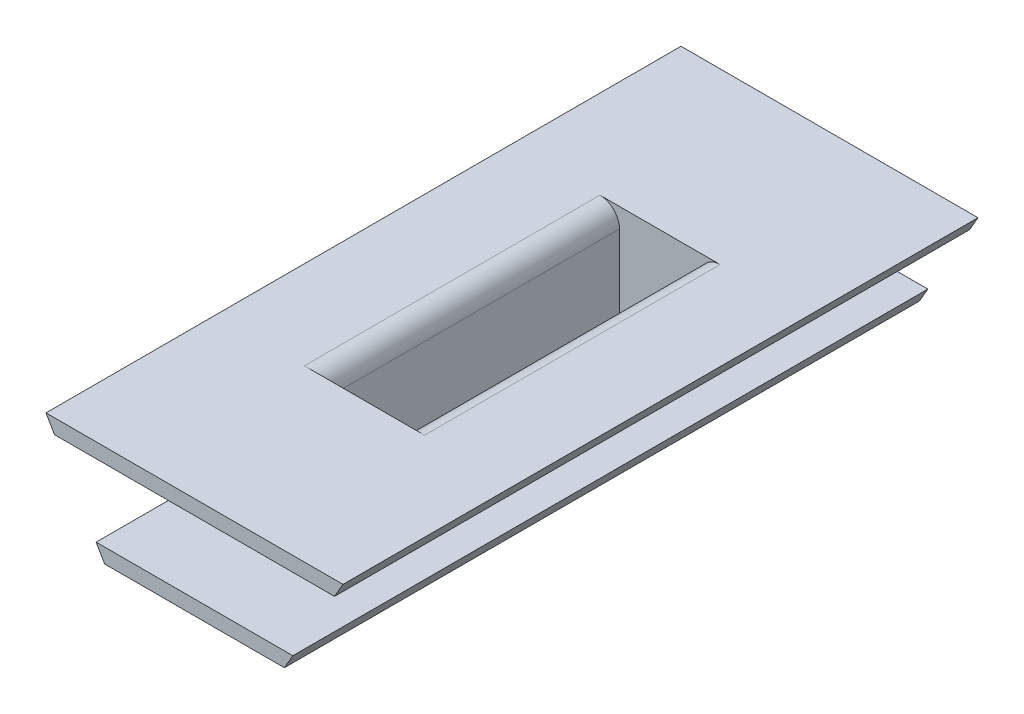
ISO-10303-21;
HEADER;
FILE_DESCRIPTION(('STEP AP214'),'2;1');
FILE_NAME('part.step','',(''),(''),'','','');
FILE_SCHEMA(('AUTOMOTIVE_DESIGN { 1 0 10303 214 1 1 1 1 }'));
ENDSEC;
DATA;
#1=APPLICATION_CONTEXT('core data for automotive mechanical design processes');
#2=APPLICATION_PROTOCOL_DEFINITION('international standard','automotive_design',2000,#1);
#3=PRODUCT_CONTEXT('',#1,'mechanical');
#4=PRODUCT('Part','Part','',(#3));
#5=PRODUCT_RELATED_PRODUCT_CATEGORY('part','',(#4));
#6=PRODUCT_DEFINITION_FORMATION('','',#4);
#7=PRODUCT_DEFINITION_CONTEXT('part definition',#1,'design');
#8=PRODUCT_DEFINITION('design','',#6,#7);
#9=PRODUCT_DEFINITION_SHAPE('','',#8);
#10=(LENGTH_UNIT() NAMED_UNIT(*) SI_UNIT(.MILLI.,.METRE.));
#11=(NAMED_UNIT(*) PLANE_ANGLE_UNIT() SI_UNIT($,.RADIAN.));
#12=(NAMED_UNIT(*) SI_UNIT($,.STERADIAN.) SOLID_ANGLE_UNIT());
#13=UNCERTAINTY_MEASURE_WITH_UNIT(LENGTH_MEASURE(1.E-05),#10,'distance_accuracy_value','');
#14=(GEOMETRIC_REPRESENTATION_CONTEXT(3) GLOBAL_UNCERTAINTY_ASSIGNED_CONTEXT((#13)) GLOBAL_UNIT_ASSIGNED_CONTEXT((#10,
#11,#12)) REPRESENTATION_CONTEXT('',''));
#15=CARTESIAN_POINT('',(0.,0.,0.));
#16=DIRECTION('',(0.,0.,1.));
#17=DIRECTION('',(1.,0.,0.));
#18=AXIS2_PLACEMENT_3D('',#15,#16,#17);
#19=CARTESIAN_POINT('',(0.,0.,0.));
#20=DIRECTION('',(0.,0.,1.));
#21=DIRECTION('',(1.,0.,0.));
#22=AXIS2_PLACEMENT_3D('',#19,#20,#21);
#23=PLANE('',#22);
#24=DIRECTION('',(1.,0.,0.));
#25=VECTOR('',#24,1.);
#26=CARTESIAN_POINT('',(0.,8.89230484541331,0.));
#27=LINE('',#26,#25);
#28=CARTESIAN_POINT('',(5.15,8.89230484541331,0.));
#29=VERTEX_POINT('',#28);
#30=CARTESIAN_POINT('',(14.3339745962156,8.89230484541331,0.));
#31=VERTEX_POINT('',#30);
#32=EDGE_CURVE('E344',#29,#31,#27,.T.);
#33=ORIENTED_EDGE('',*,*,#32,.F.);
#34=DIRECTION('',(0.,-1.,0.));
#35=VECTOR('',#34,1.);
#36=CARTESIAN_POINT('',(5.15,1.5,0.));
#37=LINE('',#36,#35);
#38=CARTESIAN_POINT('',(5.15,8.90522356007797,0.));
#39=VERTEX_POINT('',#38);
#40=EDGE_CURVE('E275',#39,#29,#37,.T.);
#41=ORIENTED_EDGE('',*,*,#40,.F.);
#42=DIRECTION('',(1.,0.,0.));
#43=VECTOR('',#42,1.);
#44=CARTESIAN_POINT('',(5.15,8.90522356007797,0.));
#45=LINE('',#44,#43);
#46=CARTESIAN_POINT('',(-5.15,8.90522356007797,0.));
#47=VERTEX_POINT('',#46);
#48=EDGE_CURVE('E287',#47,#39,#45,.T.);
#49=ORIENTED_EDGE('',*,*,#48,.F.);
#50=DIRECTION('',(0.,-1.,0.));
#51=VECTOR('',#50,1.);
#52=CARTESIAN_POINT('',(-5.15,0.,0.));
#53=LINE('',#52,#51);
#54=CARTESIAN_POINT('',(-5.15,8.89230484541331,0.));
#55=VERTEX_POINT('',#54);
#56=EDGE_CURVE('E464',#47,#55,#53,.T.);
#57=ORIENTED_EDGE('',*,*,#56,.T.);
#58=DIRECTION('',(1.,0.,0.));
#59=VECTOR('',#58,1.);
#60=CARTESIAN_POINT('',(0.,8.89230484541331,0.));
#61=LINE('',#60,#59);
#62=CARTESIAN_POINT('',(-14.3339745962156,8.89230484541331,0.));
#63=VERTEX_POINT('',#62);
#64=EDGE_CURVE('E399',#63,#55,#61,.T.);
#65=ORIENTED_EDGE('',*,*,#64,.F.);
#66=DIRECTION('',(-0.499999999999998,0.86602540378444,0.));
#67=VECTOR('',#66,1.);
#68=CARTESIAN_POINT('',(-6.90000000000002,-3.98371685740841,0.));
#69=LINE('',#68,#67);
#70=CARTESIAN_POINT('',(-15.2,10.3923048454133,0.));
#71=VERTEX_POINT('',#70);
#72=EDGE_CURVE('E395',#63,#71,#69,.T.);
#73=ORIENTED_EDGE('',*,*,#72,.T.);
#74=DIRECTION('',(1.,0.,0.));
#75=VECTOR('',#74,1.);
#76=CARTESIAN_POINT('',(0.,10.3923048454133,0.));
#77=LINE('',#76,#75);
#78=CARTESIAN_POINT('',(15.2,10.3923048454133,0.));
#79=VERTEX_POINT('',#78);
#80=EDGE_CURVE('E391',#71,#79,#77,.T.);
#81=ORIENTED_EDGE('',*,*,#80,.T.);
#82=DIRECTION('',(0.499999999999998,0.86602540378444,0.));
#83=VECTOR('',#82,1.);
#84=CARTESIAN_POINT('',(6.90000000000002,-3.98371685740841,0.));
#85=LINE('',#84,#83);
#86=EDGE_CURVE('E387',#31,#79,#85,.T.);
#87=ORIENTED_EDGE('',*,*,#86,.F.);
#88=EDGE_LOOP('',(#33,#41,#49,#57,#65,#73,#81,#87));
#89=FACE_BOUND('',#88,.T.);
#90=ADVANCED_FACE('F38',(#89),#23,.F.);
#91=CARTESIAN_POINT('',(0.,0.,65.));
#92=DIRECTION('',(0.,0.,1.));
#93=DIRECTION('',(1.,0.,0.));
#94=AXIS2_PLACEMENT_3D('',#91,#92,#93);
#95=PLANE('',#94);
#96=DIRECTION('',(0.,-1.,0.));
#97=VECTOR('',#96,1.);
#98=CARTESIAN_POINT('',(-5.15,1.5,65.));
#99=LINE('',#98,#97);
#100=CARTESIAN_POINT('',(-5.15,8.89239568237227,65.));
#101=VERTEX_POINT('',#100);
#102=CARTESIAN_POINT('',(-5.15,8.89230484541331,65.));
#103=VERTEX_POINT('',#102);
#104=EDGE_CURVE('E318',#101,#103,#99,.T.);
#105=ORIENTED_EDGE('',*,*,#104,.F.);
#106=DIRECTION('',(-1.,0.,0.));
#107=VECTOR('',#106,1.);
#108=CARTESIAN_POINT('',(-5.15,8.89239568237227,65.));
#109=LINE('',#108,#107);
#110=CARTESIAN_POINT('',(5.15,8.89239568237227,65.));
#111=VERTEX_POINT('',#110);
#112=EDGE_CURVE('E324',#111,#101,#109,.T.);
#113=ORIENTED_EDGE('',*,*,#112,.F.);
#114=DIRECTION('',(0.,1.,0.));
#115=VECTOR('',#114,1.);
#116=CARTESIAN_POINT('',(5.15,0.,65.));
#117=LINE('',#116,#115);
#118=CARTESIAN_POINT('',(5.15,8.89230484541331,65.));
#119=VERTEX_POINT('',#118);
#120=EDGE_CURVE('E461',#119,#111,#117,.T.);
#121=ORIENTED_EDGE('',*,*,#120,.F.);
#122=DIRECTION('',(1.,0.,0.));
#123=VECTOR('',#122,1.);
#124=CARTESIAN_POINT('',(0.,8.89230484541331,65.));
#125=LINE('',#124,#123);
#126=CARTESIAN_POINT('',(14.3339745962156,8.89230484541331,65.));
#127=VERTEX_POINT('',#126);
#128=EDGE_CURVE('E348',#119,#127,#125,.T.);
#129=ORIENTED_EDGE('',*,*,#128,.T.);
#130=DIRECTION('',(0.499999999999998,0.86602540378444,0.));
#131=VECTOR('',#130,1.);
#132=CARTESIAN_POINT('',(6.90000000000002,-3.98371685740841,65.));
#133=LINE('',#132,#131);
#134=CARTESIAN_POINT('',(15.2,10.3923048454133,65.));
#135=VERTEX_POINT('',#134);
#136=EDGE_CURVE('E352',#127,#135,#133,.T.);
#137=ORIENTED_EDGE('',*,*,#136,.T.);
#138=DIRECTION('',(1.,0.,0.));
#139=VECTOR('',#138,1.);
#140=CARTESIAN_POINT('',(0.,10.3923048454133,65.));
#141=LINE('',#140,#139);
#142=CARTESIAN_POINT('',(-15.2,10.3923048454133,65.));
#143=VERTEX_POINT('',#142);
#144=EDGE_CURVE('E356',#143,#135,#141,.T.);
#145=ORIENTED_EDGE('',*,*,#144,.F.);
#146=DIRECTION('',(-0.499999999999998,0.86602540378444,0.));
#147=VECTOR('',#146,1.);
#148=CARTESIAN_POINT('',(-6.90000000000002,-3.98371685740841,65.));
#149=LINE('',#148,#147);
#150=CARTESIAN_POINT('',(-14.3339745962156,8.89230484541331,65.));
#151=VERTEX_POINT('',#150);
#152=EDGE_CURVE('E360',#151,#143,#149,.T.);
#153=ORIENTED_EDGE('',*,*,#152,.F.);
#154=DIRECTION('',(1.,0.,0.));
#155=VECTOR('',#154,1.);
#156=CARTESIAN_POINT('',(0.,8.89230484541331,65.));
#157=LINE('',#156,#155);
#158=EDGE_CURVE('E364',#151,#103,#157,.T.);
#159=ORIENTED_EDGE('',*,*,#158,.T.);
#160=EDGE_LOOP('',(#105,#113,#121,#129,#137,#145,#153,#159));
#161=FACE_BOUND('',#160,.T.);
#162=ADVANCED_FACE('F577',(#161),#95,.T.);
#163=CARTESIAN_POINT('',(0.,8.89230484541331,65.));
#164=DIRECTION('',(0.,1.,0.));
#165=DIRECTION('',(0.,0.,1.));
#166=AXIS2_PLACEMENT_3D('',#163,#164,#165);
#167=PLANE('',#166);
#168=ORIENTED_EDGE('',*,*,#32,.T.);
#169=DIRECTION('',(0.,0.,-1.));
#170=VECTOR('',#169,1.);
#171=CARTESIAN_POINT('',(14.3339745962156,8.89230484541331,65.));
#172=LINE('',#171,#170);
#173=EDGE_CURVE('E457',#127,#31,#172,.T.);
#174=ORIENTED_EDGE('',*,*,#173,.F.);
#175=ORIENTED_EDGE('',*,*,#128,.F.);
#176=DIRECTION('',(0.,0.,-1.));
#177=VECTOR('',#176,1.);
#178=CARTESIAN_POINT('',(5.15,8.89230484541331,65.));
#179=LINE('',#178,#177);
#180=CARTESIAN_POINT('',(5.15,8.89230484541331,48.65));
#181=VERTEX_POINT('',#180);
#182=EDGE_CURVE('E418',#119,#181,#179,.T.);
#183=ORIENTED_EDGE('',*,*,#182,.T.);
#184=DIRECTION('',(1.,0.,0.));
#185=VECTOR('',#184,1.);
#186=CARTESIAN_POINT('',(0.,8.89230484541331,48.65));
#187=LINE('',#186,#185);
#188=CARTESIAN_POINT('',(4.15,8.89230484541331,48.65));
#189=VERTEX_POINT('',#188);
#190=EDGE_CURVE('E468',#189,#181,#187,.T.);
#191=ORIENTED_EDGE('',*,*,#190,.F.);
#192=CARTESIAN_POINT('',(4.15,8.89230484541331,47.65));
#193=DIRECTION('',(0.,1.,0.));
#194=DIRECTION('',(0.,0.,1.));
#195=AXIS2_PLACEMENT_3D('',#192,#193,#194);
#196=CIRCLE('',#195,1.);
#197=CARTESIAN_POINT('',(5.15,8.89230484541331,47.65));
#198=VERTEX_POINT('',#197);
#199=EDGE_CURVE('E516',#189,#198,#196,.T.);
#200=ORIENTED_EDGE('',*,*,#199,.T.);
#201=CARTESIAN_POINT('',(5.15,8.89230484541331,17.35));
#202=VERTEX_POINT('',#201);
#203=EDGE_CURVE('E383',#198,#202,#179,.T.);
#204=ORIENTED_EDGE('',*,*,#203,.T.);
#205=CARTESIAN_POINT('',(4.15,8.89230484541331,17.35));
#206=DIRECTION('',(0.,1.,0.));
#207=DIRECTION('',(0.,0.,1.));
#208=AXIS2_PLACEMENT_3D('',#205,#206,#207);
#209=CIRCLE('',#208,1.);
#210=CARTESIAN_POINT('',(4.15,8.89230484541331,16.35));
#211=VERTEX_POINT('',#210);
#212=EDGE_CURVE('E531',#202,#211,#209,.T.);
#213=ORIENTED_EDGE('',*,*,#212,.T.);
#214=DIRECTION('',(-1.,0.,0.));
#215=VECTOR('',#214,1.);
#216=CARTESIAN_POINT('',(0.,8.89230484541331,16.35));
#217=LINE('',#216,#215);
#218=CARTESIAN_POINT('',(5.15,8.89230484541331,16.35));
#219=VERTEX_POINT('',#218);
#220=EDGE_CURVE('E495',#219,#211,#217,.T.);
#221=ORIENTED_EDGE('',*,*,#220,.F.);
#222=DIRECTION('',(0.,0.,-1.));
#223=VECTOR('',#222,1.);
#224=CARTESIAN_POINT('',(5.15,8.89230484541331,65.));
#225=LINE('',#224,#223);
#226=EDGE_CURVE('E314',#219,#29,#225,.T.);
#227=ORIENTED_EDGE('',*,*,#226,.T.);
#228=EDGE_LOOP('',(#168,#174,#175,#183,#191,#200,#204,#213,#221,#227));
#229=FACE_BOUND('',#228,.T.);
#230=ADVANCED_FACE('F584',(#229),#167,.F.);
#231=CARTESIAN_POINT('',(6.90000000000002,-3.98371685740841,65.));
#232=DIRECTION('',(-0.86602540378444,0.499999999999998,0.));
#233=DIRECTION('',(-0.499999999999998,-0.86602540378444,0.));
#234=AXIS2_PLACEMENT_3D('',#231,#232,#233);
#235=PLANE('',#234);
#236=ORIENTED_EDGE('',*,*,#86,.T.);
#237=DIRECTION('',(0.,0.,-1.));
#238=VECTOR('',#237,1.);
#239=CARTESIAN_POINT('',(15.2,10.3923048454133,65.));
#240=LINE('',#239,#238);
#241=EDGE_CURVE('E454',#135,#79,#240,.T.);
#242=ORIENTED_EDGE('',*,*,#241,.F.);
#243=ORIENTED_EDGE('',*,*,#136,.F.);
#244=ORIENTED_EDGE('',*,*,#173,.T.);
#245=EDGE_LOOP('',(#236,#242,#243,#244));
#246=FACE_BOUND('',#245,.T.);
#247=ADVANCED_FACE('F641',(#246),#235,.F.);
#248=CARTESIAN_POINT('',(0.,10.3923048454133,65.));
#249=DIRECTION('',(0.,1.,0.));
#250=DIRECTION('',(0.,0.,1.));
#251=AXIS2_PLACEMENT_3D('',#248,#249,#250);
#252=PLANE('',#251);
#253=DIRECTION('',(0.,0.,1.));
#254=VECTOR('',#253,1.);
#255=CARTESIAN_POINT('',(6.15,10.3923048454133,65.));
#256=LINE('',#255,#254);
#257=CARTESIAN_POINT('',(6.15,10.3923048454133,17.35));
#258=VERTEX_POINT('',#257);
#259=CARTESIAN_POINT('',(6.15,10.3923048454133,47.6056545691248));
#260=VERTEX_POINT('',#259);
#261=EDGE_CURVE('E538',#258,#260,#256,.T.);
#262=ORIENTED_EDGE('',*,*,#261,.T.);
#263=DIRECTION('',(1.,0.,0.));
#264=VECTOR('',#263,1.);
#265=CARTESIAN_POINT('',(-4.15,10.3923048454133,47.6056545691248));
#266=LINE('',#265,#264);
#267=CARTESIAN_POINT('',(-6.15,10.3923048454133,47.6056545691248));
#268=VERTEX_POINT('',#267);
#269=EDGE_CURVE('E263',#268,#260,#266,.T.);
#270=ORIENTED_EDGE('',*,*,#269,.F.);
#271=DIRECTION('',(0.,0.,1.));
#272=VECTOR('',#271,1.);
#273=CARTESIAN_POINT('',(-6.15,10.3923048454133,17.35));
#274=LINE('',#273,#272);
#275=CARTESIAN_POINT('',(-6.15,10.3923048454133,17.35));
#276=VERTEX_POINT('',#275);
#277=EDGE_CURVE('E534',#268,#276,#274,.F.);
#278=ORIENTED_EDGE('',*,*,#277,.T.);
#279=DIRECTION('',(1.,0.,0.));
#280=VECTOR('',#279,1.);
#281=CARTESIAN_POINT('',(-4.15,10.3923048454133,17.35));
#282=LINE('',#281,#280);
#283=EDGE_CURVE('E260',#276,#258,#282,.T.);
#284=ORIENTED_EDGE('',*,*,#283,.T.);
#285=EDGE_LOOP('',(#262,#270,#278,#284));
#286=FACE_BOUND('',#285,.T.);
#287=ORIENTED_EDGE('',*,*,#80,.F.);
#288=DIRECTION('',(0.,0.,-1.));
#289=VECTOR('',#288,1.);
#290=CARTESIAN_POINT('',(-15.2,10.3923048454133,65.));
#291=LINE('',#290,#289);
#292=EDGE_CURVE('E451',#143,#71,#291,.T.);
#293=ORIENTED_EDGE('',*,*,#292,.F.);
#294=ORIENTED_EDGE('',*,*,#144,.T.);
#295=ORIENTED_EDGE('',*,*,#241,.T.);
#296=EDGE_LOOP('',(#287,#293,#294,#295));
#297=FACE_BOUND('',#296,.T.);
#298=ADVANCED_FACE('F556',(#286,#297),#252,.T.);
#299=CARTESIAN_POINT('',(-6.90000000000002,-3.98371685740841,65.));
#300=DIRECTION('',(-0.86602540378444,-0.499999999999998,0.));
#301=DIRECTION('',(0.499999999999998,-0.86602540378444,0.));
#302=AXIS2_PLACEMENT_3D('',#299,#300,#301);
#303=PLANE('',#302);
#304=ORIENTED_EDGE('',*,*,#72,.F.);
#305=DIRECTION('',(0.,0.,-1.));
#306=VECTOR('',#305,1.);
#307=CARTESIAN_POINT('',(-14.3339745962156,8.89230484541331,65.));
#308=LINE('',#307,#306);
#309=EDGE_CURVE('E448',#151,#63,#308,.T.);
#310=ORIENTED_EDGE('',*,*,#309,.F.);
#311=ORIENTED_EDGE('',*,*,#152,.T.);
#312=ORIENTED_EDGE('',*,*,#292,.T.);
#313=EDGE_LOOP('',(#304,#310,#311,#312));
#314=FACE_BOUND('',#313,.T.);
#315=ADVANCED_FACE('F634',(#314),#303,.T.);
#316=CARTESIAN_POINT('',(0.,8.89230484541331,65.));
#317=DIRECTION('',(0.,1.,0.));
#318=DIRECTION('',(0.,0.,1.));
#319=AXIS2_PLACEMENT_3D('',#316,#317,#318);
#320=PLANE('',#319);
#321=ORIENTED_EDGE('',*,*,#64,.T.);
#322=DIRECTION('',(0.,0.,1.));
#323=VECTOR('',#322,1.);
#324=CARTESIAN_POINT('',(-5.15,8.89230484541331,65.));
#325=LINE('',#324,#323);
#326=CARTESIAN_POINT('',(-5.15,8.89230484541331,16.35));
#327=VERTEX_POINT('',#326);
#328=EDGE_CURVE('E307',#55,#327,#325,.T.);
#329=ORIENTED_EDGE('',*,*,#328,.T.);
#330=DIRECTION('',(-1.,0.,0.));
#331=VECTOR('',#330,1.);
#332=CARTESIAN_POINT('',(0.,8.89230484541331,16.35));
#333=LINE('',#332,#331);
#334=CARTESIAN_POINT('',(-4.15,8.89230484541331,16.35));
#335=VERTEX_POINT('',#334);
#336=EDGE_CURVE('E503',#335,#327,#333,.T.);
#337=ORIENTED_EDGE('',*,*,#336,.F.);
#338=CARTESIAN_POINT('',(-4.15,8.89230484541331,17.35));
#339=DIRECTION('',(0.,1.,0.));
#340=DIRECTION('',(0.,0.,1.));
#341=AXIS2_PLACEMENT_3D('',#338,#339,#340);
#342=CIRCLE('',#341,1.);
#343=CARTESIAN_POINT('',(-5.15,8.89230484541331,17.35));
#344=VERTEX_POINT('',#343);
#345=EDGE_CURVE('E522',#335,#344,#342,.T.);
#346=ORIENTED_EDGE('',*,*,#345,.T.);
#347=DIRECTION('',(0.,0.,-1.));
#348=VECTOR('',#347,1.);
#349=CARTESIAN_POINT('',(-5.15,8.89230484541331,65.));
#350=LINE('',#349,#348);
#351=CARTESIAN_POINT('',(-5.15,8.89230484541331,47.65));
#352=VERTEX_POINT('',#351);
#353=EDGE_CURVE('E443',#352,#344,#350,.T.);
#354=ORIENTED_EDGE('',*,*,#353,.F.);
#355=CARTESIAN_POINT('',(-4.15,8.89230484541331,47.65));
#356=DIRECTION('',(0.,1.,0.));
#357=DIRECTION('',(0.,0.,1.));
#358=AXIS2_PLACEMENT_3D('',#355,#356,#357);
#359=CIRCLE('',#358,1.);
#360=CARTESIAN_POINT('',(-4.15,8.89230484541331,48.65));
#361=VERTEX_POINT('',#360);
#362=EDGE_CURVE('E513',#352,#361,#359,.T.);
#363=ORIENTED_EDGE('',*,*,#362,.T.);
#364=DIRECTION('',(1.,0.,0.));
#365=VECTOR('',#364,1.);
#366=CARTESIAN_POINT('',(0.,8.89230484541331,48.65));
#367=LINE('',#366,#365);
#368=CARTESIAN_POINT('',(-5.15,8.89230484541331,48.65));
#369=VERTEX_POINT('',#368);
#370=EDGE_CURVE('E475',#369,#361,#367,.T.);
#371=ORIENTED_EDGE('',*,*,#370,.F.);
#372=EDGE_CURVE('E444',#103,#369,#350,.T.);
#373=ORIENTED_EDGE('',*,*,#372,.F.);
#374=ORIENTED_EDGE('',*,*,#158,.F.);
#375=ORIENTED_EDGE('',*,*,#309,.T.);
#376=EDGE_LOOP('',(#321,#329,#337,#346,#354,#363,#371,#373,#374,#375));
#377=FACE_BOUND('',#376,.T.);
#378=ADVANCED_FACE('F630',(#377),#320,.F.);
#379=CARTESIAN_POINT('',(-5.15,0.,65.));
#380=DIRECTION('',(1.,0.,0.));
#381=DIRECTION('',(0.,0.,-1.));
#382=AXIS2_PLACEMENT_3D('',#379,#380,#381);
#383=PLANE('',#382);
#384=DIRECTION('',(0.,0.,-1.));
#385=VECTOR('',#384,1.);
#386=CARTESIAN_POINT('',(-5.15,1.5,65.));
#387=LINE('',#386,#385);
#388=CARTESIAN_POINT('',(-5.15,1.5,47.65));
#389=VERTEX_POINT('',#388);
#390=CARTESIAN_POINT('',(-5.15,1.5,17.35));
#391=VERTEX_POINT('',#390);
#392=EDGE_CURVE('E439',#389,#391,#387,.T.);
#393=ORIENTED_EDGE('',*,*,#392,.F.);
#394=DIRECTION('',(0.,-1.,0.));
#395=VECTOR('',#394,1.);
#396=CARTESIAN_POINT('',(-5.15,0.,47.65));
#397=LINE('',#396,#395);
#398=EDGE_CURVE('E486',#389,#352,#397,.F.);
#399=ORIENTED_EDGE('',*,*,#398,.T.);
#400=ORIENTED_EDGE('',*,*,#353,.T.);
#401=DIRECTION('',(0.,1.,0.));
#402=VECTOR('',#401,1.);
#403=CARTESIAN_POINT('',(-5.15,0.,17.35));
#404=LINE('',#403,#402);
#405=EDGE_CURVE('E483',#344,#391,#404,.F.);
#406=ORIENTED_EDGE('',*,*,#405,.T.);
#407=EDGE_LOOP('',(#393,#399,#400,#406));
#408=FACE_BOUND('',#407,.T.);
#409=ADVANCED_FACE('F624',(#408),#383,.F.);
#410=CARTESIAN_POINT('',(-6.90000000000002,-3.98371685740841,65.));
#411=DIRECTION('',(-0.86602540378444,-0.499999999999998,0.));
#412=DIRECTION('',(0.499999999999998,-0.86602540378444,0.));
#413=AXIS2_PLACEMENT_3D('',#410,#411,#412);
#414=PLANE('',#413);
#415=DIRECTION('',(-0.499999999999998,0.86602540378444,0.));
#416=VECTOR('',#415,1.);
#417=CARTESIAN_POINT('',(-6.90000000000002,-3.98371685740841,0.));
#418=LINE('',#417,#416);
#419=CARTESIAN_POINT('',(-9.2,0.,0.));
#420=VERTEX_POINT('',#419);
#421=CARTESIAN_POINT('',(-10.0660254037844,1.5,0.));
#422=VERTEX_POINT('',#421);
#423=EDGE_CURVE('E403',#420,#422,#418,.T.);
#424=ORIENTED_EDGE('',*,*,#423,.F.);
#425=DIRECTION('',(0.,0.,-1.));
#426=VECTOR('',#425,1.);
#427=CARTESIAN_POINT('',(-9.2,0.,65.));
#428=LINE('',#427,#426);
#429=CARTESIAN_POINT('',(-9.2,0.,65.));
#430=VERTEX_POINT('',#429);
#431=EDGE_CURVE('E432',#430,#420,#428,.T.);
#432=ORIENTED_EDGE('',*,*,#431,.F.);
#433=DIRECTION('',(-0.499999999999998,0.86602540378444,0.));
#434=VECTOR('',#433,1.);
#435=CARTESIAN_POINT('',(-6.90000000000002,-3.98371685740841,65.));
#436=LINE('',#435,#434);
#437=CARTESIAN_POINT('',(-10.0660254037844,1.5,65.));
#438=VERTEX_POINT('',#437);
#439=EDGE_CURVE('E371',#430,#438,#436,.T.);
#440=ORIENTED_EDGE('',*,*,#439,.T.);
#441=DIRECTION('',(0.,0.,-1.));
#442=VECTOR('',#441,1.);
#443=CARTESIAN_POINT('',(-10.0660254037844,1.5,65.));
#444=LINE('',#443,#442);
#445=EDGE_CURVE('E435',#438,#422,#444,.T.);
#446=ORIENTED_EDGE('',*,*,#445,.T.);
#447=EDGE_LOOP('',(#424,#432,#440,#446));
#448=FACE_BOUND('',#447,.T.);
#449=ADVANCED_FACE('F606',(#448),#414,.T.);
#450=CARTESIAN_POINT('',(0.,0.,65.));
#451=DIRECTION('',(0.,-1.,0.));
#452=DIRECTION('',(0.,0.,-1.));
#453=AXIS2_PLACEMENT_3D('',#450,#451,#452);
#454=PLANE('',#453);
#455=DIRECTION('',(0.,0.,1.));
#456=VECTOR('',#455,1.);
#457=CARTESIAN_POINT('',(-4.15,0.,17.35));
#458=LINE('',#457,#456);
#459=CARTESIAN_POINT('',(-4.15,0.,17.35));
#460=VERTEX_POINT('',#459);
#461=CARTESIAN_POINT('',(-4.15,0.,47.6056545691248));
#462=VERTEX_POINT('',#461);
#463=EDGE_CURVE('E239',#460,#462,#458,.T.);
#464=ORIENTED_EDGE('',*,*,#463,.T.);
#465=DIRECTION('',(1.,0.,0.));
#466=VECTOR('',#465,1.);
#467=CARTESIAN_POINT('',(-4.15,0.,47.6056545691248));
#468=LINE('',#467,#466);
#469=CARTESIAN_POINT('',(4.15,0.,47.6056545691248));
#470=VERTEX_POINT('',#469);
#471=EDGE_CURVE('E248',#462,#470,#468,.T.);
#472=ORIENTED_EDGE('',*,*,#471,.T.);
#473=DIRECTION('',(0.,0.,1.));
#474=VECTOR('',#473,1.);
#475=CARTESIAN_POINT('',(4.15,0.,17.35));
#476=LINE('',#475,#474);
#477=CARTESIAN_POINT('',(4.15,0.,17.35));
#478=VERTEX_POINT('',#477);
#479=EDGE_CURVE('E255',#478,#470,#476,.T.);
#480=ORIENTED_EDGE('',*,*,#479,.F.);
#481=DIRECTION('',(1.,0.,0.));
#482=VECTOR('',#481,1.);
#483=CARTESIAN_POINT('',(-4.15,0.,17.35));
#484=LINE('',#483,#482);
#485=EDGE_CURVE('E245',#460,#478,#484,.T.);
#486=ORIENTED_EDGE('',*,*,#485,.F.);
#487=EDGE_LOOP('',(#464,#472,#480,#486));
#488=FACE_BOUND('',#487,.T.);
#489=DIRECTION('',(-1.,0.,0.));
#490=VECTOR('',#489,1.);
#491=CARTESIAN_POINT('',(0.,0.,0.));
#492=LINE('',#491,#490);
#493=CARTESIAN_POINT('',(9.2,0.,0.));
#494=VERTEX_POINT('',#493);
#495=EDGE_CURVE('E407',#494,#420,#492,.T.);
#496=ORIENTED_EDGE('',*,*,#495,.F.);
#497=DIRECTION('',(0.,0.,-1.));
#498=VECTOR('',#497,1.);
#499=CARTESIAN_POINT('',(9.2,0.,65.));
#500=LINE('',#499,#498);
#501=CARTESIAN_POINT('',(9.2,0.,65.));
#502=VERTEX_POINT('',#501);
#503=EDGE_CURVE('E429',#502,#494,#500,.T.);
#504=ORIENTED_EDGE('',*,*,#503,.F.);
#505=DIRECTION('',(-1.,0.,0.));
#506=VECTOR('',#505,1.);
#507=CARTESIAN_POINT('',(0.,0.,65.));
#508=LINE('',#507,#506);
#509=EDGE_CURVE('E375',#502,#430,#508,.T.);
#510=ORIENTED_EDGE('',*,*,#509,.T.);
#511=ORIENTED_EDGE('',*,*,#431,.T.);
#512=EDGE_LOOP('',(#496,#504,#510,#511));
#513=FACE_BOUND('',#512,.T.);
#514=ADVANCED_FACE('F257',(#488,#513),#454,.T.);
#515=CARTESIAN_POINT('',(6.90000000000002,-3.98371685740841,65.));
#516=DIRECTION('',(-0.86602540378444,0.499999999999998,0.));
#517=DIRECTION('',(-0.499999999999998,-0.86602540378444,0.));
#518=AXIS2_PLACEMENT_3D('',#515,#516,#517);
#519=PLANE('',#518);
#520=DIRECTION('',(0.499999999999998,0.86602540378444,0.));
#521=VECTOR('',#520,1.);
#522=CARTESIAN_POINT('',(6.90000000000002,-3.98371685740841,0.));
#523=LINE('',#522,#521);
#524=CARTESIAN_POINT('',(10.0660254037844,1.5,0.));
#525=VERTEX_POINT('',#524);
#526=EDGE_CURVE('E411',#494,#525,#523,.T.);
#527=ORIENTED_EDGE('',*,*,#526,.T.);
#528=DIRECTION('',(0.,0.,-1.));
#529=VECTOR('',#528,1.);
#530=CARTESIAN_POINT('',(10.0660254037844,1.5,65.));
#531=LINE('',#530,#529);
#532=CARTESIAN_POINT('',(10.0660254037844,1.5,65.));
#533=VERTEX_POINT('',#532);
#534=EDGE_CURVE('E426',#533,#525,#531,.T.);
#535=ORIENTED_EDGE('',*,*,#534,.F.);
#536=DIRECTION('',(0.499999999999998,0.86602540378444,0.));
#537=VECTOR('',#536,1.);
#538=CARTESIAN_POINT('',(6.90000000000002,-3.98371685740841,65.));
#539=LINE('',#538,#537);
#540=EDGE_CURVE('E379',#502,#533,#539,.T.);
#541=ORIENTED_EDGE('',*,*,#540,.F.);
#542=ORIENTED_EDGE('',*,*,#503,.T.);
#543=EDGE_LOOP('',(#527,#535,#541,#542));
#544=FACE_BOUND('',#543,.T.);
#545=ADVANCED_FACE('F616',(#544),#519,.F.);
#546=CARTESIAN_POINT('',(0.,1.5,65.));
#547=DIRECTION('',(0.,1.,0.));
#548=DIRECTION('',(-1.,0.,0.));
#549=AXIS2_PLACEMENT_3D('',#546,#547,#548);
#550=PLANE('',#549);
#551=DIRECTION('',(1.,0.,0.));
#552=VECTOR('',#551,1.);
#553=CARTESIAN_POINT('',(0.,1.5,0.));
#554=LINE('',#553,#552);
#555=EDGE_CURVE('E353',#422,#525,#554,.T.);
#556=ORIENTED_EDGE('',*,*,#555,.F.);
#557=ORIENTED_EDGE('',*,*,#445,.F.);
#558=DIRECTION('',(1.,0.,0.));
#559=VECTOR('',#558,1.);
#560=CARTESIAN_POINT('',(0.,1.5,65.));
#561=LINE('',#560,#559);
#562=EDGE_CURVE('E368',#438,#533,#561,.T.);
#563=ORIENTED_EDGE('',*,*,#562,.T.);
#564=ORIENTED_EDGE('',*,*,#534,.T.);
#565=EDGE_LOOP('',(#556,#557,#563,#564));
#566=FACE_BOUND('',#565,.T.);
#567=DIRECTION('',(1.,0.,0.));
#568=VECTOR('',#567,1.);
#569=CARTESIAN_POINT('',(-5.15,1.5,48.65));
#570=LINE('',#569,#568);
#571=CARTESIAN_POINT('',(-4.15,1.5,48.65));
#572=VERTEX_POINT('',#571);
#573=CARTESIAN_POINT('',(4.15,1.5,48.65));
#574=VERTEX_POINT('',#573);
#575=EDGE_CURVE('E323',#572,#574,#570,.T.);
#576=ORIENTED_EDGE('',*,*,#575,.F.);
#577=CARTESIAN_POINT('',(-4.15,1.5,47.65));
#578=DIRECTION('',(0.,1.,0.));
#579=DIRECTION('',(-1.,0.,0.));
#580=AXIS2_PLACEMENT_3D('',#577,#578,#579);
#581=CIRCLE('',#580,1.);
#582=EDGE_CURVE('E510',#572,#389,#581,.F.);
#583=ORIENTED_EDGE('',*,*,#582,.T.);
#584=ORIENTED_EDGE('',*,*,#392,.T.);
#585=CARTESIAN_POINT('',(-4.15,1.5,17.35));
#586=DIRECTION('',(0.,1.,0.));
#587=DIRECTION('',(-1.,0.,0.));
#588=AXIS2_PLACEMENT_3D('',#585,#586,#587);
#589=CIRCLE('',#588,1.);
#590=CARTESIAN_POINT('',(-4.15,1.5,16.35));
#591=VERTEX_POINT('',#590);
#592=EDGE_CURVE('E525',#391,#591,#589,.F.);
#593=ORIENTED_EDGE('',*,*,#592,.T.);
#594=DIRECTION('',(-1.,0.,0.));
#595=VECTOR('',#594,1.);
#596=CARTESIAN_POINT('',(5.15,1.5,16.35));
#597=LINE('',#596,#595);
#598=CARTESIAN_POINT('',(4.15,1.5,16.35));
#599=VERTEX_POINT('',#598);
#600=EDGE_CURVE('E286',#599,#591,#597,.T.);
#601=ORIENTED_EDGE('',*,*,#600,.F.);
#602=CARTESIAN_POINT('',(4.15,1.5,17.35));
#603=DIRECTION('',(0.,1.,0.));
#604=DIRECTION('',(-1.,0.,0.));
#605=AXIS2_PLACEMENT_3D('',#602,#603,#604);
#606=CIRCLE('',#605,1.);
#607=CARTESIAN_POINT('',(5.15,1.5,17.35));
#608=VERTEX_POINT('',#607);
#609=EDGE_CURVE('E528',#599,#608,#606,.F.);
#610=ORIENTED_EDGE('',*,*,#609,.T.);
#611=DIRECTION('',(0.,0.,-1.));
#612=VECTOR('',#611,1.);
#613=CARTESIAN_POINT('',(5.15,1.5,65.));
#614=LINE('',#613,#612);
#615=CARTESIAN_POINT('',(5.15,1.5,47.65));
#616=VERTEX_POINT('',#615);
#617=EDGE_CURVE('E422',#616,#608,#614,.T.);
#618=ORIENTED_EDGE('',*,*,#617,.F.);
#619=CARTESIAN_POINT('',(4.15,1.5,47.65));
#620=DIRECTION('',(0.,1.,0.));
#621=DIRECTION('',(-1.,0.,0.));
#622=AXIS2_PLACEMENT_3D('',#619,#620,#621);
#623=CIRCLE('',#622,1.);
#624=EDGE_CURVE('E519',#616,#574,#623,.F.);
#625=ORIENTED_EDGE('',*,*,#624,.T.);
#626=EDGE_LOOP('',(#576,#583,#584,#593,#601,#610,#618,#625));
#627=FACE_BOUND('',#626,.T.);
#628=ADVANCED_FACE('F610',(#566,#627),#550,.T.);
#629=CARTESIAN_POINT('',(5.15,0.,65.));
#630=DIRECTION('',(1.,0.,0.));
#631=DIRECTION('',(0.,0.,-1.));
#632=AXIS2_PLACEMENT_3D('',#629,#630,#631);
#633=PLANE('',#632);
#634=ORIENTED_EDGE('',*,*,#203,.F.);
#635=DIRECTION('',(0.,1.,0.));
#636=VECTOR('',#635,1.);
#637=CARTESIAN_POINT('',(5.15,1.5,47.65));
#638=LINE('',#637,#636);
#639=EDGE_CURVE('E492',#198,#616,#638,.F.);
#640=ORIENTED_EDGE('',*,*,#639,.T.);
#641=ORIENTED_EDGE('',*,*,#617,.T.);
#642=DIRECTION('',(0.,-1.,0.));
#643=VECTOR('',#642,1.);
#644=CARTESIAN_POINT('',(5.15,8.89230484541331,17.35));
#645=LINE('',#644,#643);
#646=EDGE_CURVE('E489',#608,#202,#645,.F.);
#647=ORIENTED_EDGE('',*,*,#646,.T.);
#648=EDGE_LOOP('',(#634,#640,#641,#647));
#649=FACE_BOUND('',#648,.T.);
#650=ADVANCED_FACE('F600',(#649),#633,.T.);
#651=ORIENTED_EDGE('',*,*,#540,.T.);
#652=ORIENTED_EDGE('',*,*,#562,.F.);
#653=ORIENTED_EDGE('',*,*,#439,.F.);
#654=ORIENTED_EDGE('',*,*,#509,.F.);
#655=EDGE_LOOP('',(#651,#652,#653,#654));
#656=FACE_BOUND('',#655,.T.);
#657=ADVANCED_FACE('F587',(#656),#95,.T.);
#658=ORIENTED_EDGE('',*,*,#423,.T.);
#659=ORIENTED_EDGE('',*,*,#555,.T.);
#660=ORIENTED_EDGE('',*,*,#526,.F.);
#661=ORIENTED_EDGE('',*,*,#495,.T.);
#662=EDGE_LOOP('',(#658,#659,#660,#661));
#663=FACE_BOUND('',#662,.T.);
#664=ADVANCED_FACE('F580',(#663),#23,.F.);
#665=CARTESIAN_POINT('',(-5.15,1.5,48.65));
#666=DIRECTION('',(-1.,0.,0.));
#667=DIRECTION('',(0.,0.,1.));
#668=AXIS2_PLACEMENT_3D('',#665,#666,#667);
#669=PLANE('',#668);
#670=DIRECTION('',(0.,-1.,0.));
#671=VECTOR('',#670,1.);
#672=CARTESIAN_POINT('',(-5.15,1.5,48.65));
#673=LINE('',#672,#671);
#674=CARTESIAN_POINT('',(-5.15,8.89239568237227,48.65));
#675=VERTEX_POINT('',#674);
#676=EDGE_CURVE('E319',#675,#369,#673,.T.);
#677=ORIENTED_EDGE('',*,*,#676,.F.);
#678=DIRECTION('',(0.,0.,1.));
#679=VECTOR('',#678,1.);
#680=CARTESIAN_POINT('',(-5.15,8.89239568237227,48.65));
#681=LINE('',#680,#679);
#682=EDGE_CURVE('E341',#675,#101,#681,.T.);
#683=ORIENTED_EDGE('',*,*,#682,.T.);
#684=ORIENTED_EDGE('',*,*,#104,.T.);
#685=ORIENTED_EDGE('',*,*,#372,.T.);
#686=EDGE_LOOP('',(#677,#683,#684,#685));
#687=FACE_BOUND('',#686,.T.);
#688=ADVANCED_FACE('F591',(#687),#669,.F.);
#689=CARTESIAN_POINT('',(5.15,1.5,48.65));
#690=DIRECTION('',(1.,0.,0.));
#691=DIRECTION('',(0.,0.,-1.));
#692=AXIS2_PLACEMENT_3D('',#689,#690,#691);
#693=PLANE('',#692);
#694=ORIENTED_EDGE('',*,*,#120,.T.);
#695=DIRECTION('',(0.,0.,1.));
#696=VECTOR('',#695,1.);
#697=CARTESIAN_POINT('',(5.15,8.89239568237227,48.65));
#698=LINE('',#697,#696);
#699=CARTESIAN_POINT('',(5.15,8.89239568237227,48.65));
#700=VERTEX_POINT('',#699);
#701=EDGE_CURVE('E335',#700,#111,#698,.T.);
#702=ORIENTED_EDGE('',*,*,#701,.F.);
#703=DIRECTION('',(0.,1.,0.));
#704=VECTOR('',#703,1.);
#705=CARTESIAN_POINT('',(5.15,1.5,48.65));
#706=LINE('',#705,#704);
#707=EDGE_CURVE('E328',#181,#700,#706,.T.);
#708=ORIENTED_EDGE('',*,*,#707,.F.);
#709=ORIENTED_EDGE('',*,*,#182,.F.);
#710=EDGE_LOOP('',(#694,#702,#708,#709));
#711=FACE_BOUND('',#710,.T.);
#712=ADVANCED_FACE('F597',(#711),#693,.F.);
#713=CARTESIAN_POINT('',(-5.15,8.89239568237227,48.65));
#714=DIRECTION('',(0.,1.,0.));
#715=DIRECTION('',(0.,0.,1.));
#716=AXIS2_PLACEMENT_3D('',#713,#714,#715);
#717=PLANE('',#716);
#718=ORIENTED_EDGE('',*,*,#112,.T.);
#719=ORIENTED_EDGE('',*,*,#682,.F.);
#720=DIRECTION('',(-1.,0.,0.));
#721=VECTOR('',#720,1.);
#722=CARTESIAN_POINT('',(-5.15,8.89239568237227,48.65));
#723=LINE('',#722,#721);
#724=EDGE_CURVE('E331',#700,#675,#723,.T.);
#725=ORIENTED_EDGE('',*,*,#724,.F.);
#726=ORIENTED_EDGE('',*,*,#701,.T.);
#727=EDGE_LOOP('',(#718,#719,#725,#726));
#728=FACE_BOUND('',#727,.T.);
#729=ADVANCED_FACE('F740',(#728),#717,.F.);
#730=CARTESIAN_POINT('',(0.,0.,48.65));
#731=DIRECTION('',(0.,0.,-1.));
#732=DIRECTION('',(-1.,0.,0.));
#733=AXIS2_PLACEMENT_3D('',#730,#731,#732);
#734=PLANE('',#733);
#735=ORIENTED_EDGE('',*,*,#370,.T.);
#736=DIRECTION('',(0.,-1.,0.));
#737=VECTOR('',#736,1.);
#738=CARTESIAN_POINT('',(-4.15,0.,48.65));
#739=LINE('',#738,#737);
#740=EDGE_CURVE('E479',#361,#572,#739,.T.);
#741=ORIENTED_EDGE('',*,*,#740,.T.);
#742=ORIENTED_EDGE('',*,*,#575,.T.);
#743=DIRECTION('',(0.,1.,0.));
#744=VECTOR('',#743,1.);
#745=CARTESIAN_POINT('',(4.15,8.89230484541331,48.65));
#746=LINE('',#745,#744);
#747=EDGE_CURVE('E471',#574,#189,#746,.T.);
#748=ORIENTED_EDGE('',*,*,#747,.T.);
#749=ORIENTED_EDGE('',*,*,#190,.T.);
#750=ORIENTED_EDGE('',*,*,#707,.T.);
#751=ORIENTED_EDGE('',*,*,#724,.T.);
#752=ORIENTED_EDGE('',*,*,#676,.T.);
#753=EDGE_LOOP('',(#735,#741,#742,#748,#749,#750,#751,#752));
#754=FACE_BOUND('',#753,.T.);
#755=ADVANCED_FACE('F732',(#754),#734,.F.);
#756=CARTESIAN_POINT('',(5.15,1.5,16.35));
#757=DIRECTION('',(1.,0.,0.));
#758=DIRECTION('',(0.,0.,-1.));
#759=AXIS2_PLACEMENT_3D('',#756,#757,#758);
#760=PLANE('',#759);
#761=DIRECTION('',(0.,-1.,0.));
#762=VECTOR('',#761,1.);
#763=CARTESIAN_POINT('',(5.15,1.5,16.35));
#764=LINE('',#763,#762);
#765=CARTESIAN_POINT('',(5.15,8.90522356007797,16.35));
#766=VERTEX_POINT('',#765);
#767=EDGE_CURVE('E282',#766,#219,#764,.T.);
#768=ORIENTED_EDGE('',*,*,#767,.F.);
#769=DIRECTION('',(0.,0.,-1.));
#770=VECTOR('',#769,1.);
#771=CARTESIAN_POINT('',(5.15,8.90522356007797,16.35));
#772=LINE('',#771,#770);
#773=EDGE_CURVE('E304',#766,#39,#772,.T.);
#774=ORIENTED_EDGE('',*,*,#773,.T.);
#775=ORIENTED_EDGE('',*,*,#40,.T.);
#776=ORIENTED_EDGE('',*,*,#226,.F.);
#777=EDGE_LOOP('',(#768,#774,#775,#776));
#778=FACE_BOUND('',#777,.T.);
#779=ADVANCED_FACE('F724',(#778),#760,.F.);
#780=CARTESIAN_POINT('',(-5.15,1.5,16.35));
#781=DIRECTION('',(-1.,0.,0.));
#782=DIRECTION('',(0.,0.,1.));
#783=AXIS2_PLACEMENT_3D('',#780,#781,#782);
#784=PLANE('',#783);
#785=ORIENTED_EDGE('',*,*,#56,.F.);
#786=DIRECTION('',(0.,0.,-1.));
#787=VECTOR('',#786,1.);
#788=CARTESIAN_POINT('',(-5.15,8.90522356007797,16.35));
#789=LINE('',#788,#787);
#790=CARTESIAN_POINT('',(-5.15,8.90522356007797,16.35));
#791=VERTEX_POINT('',#790);
#792=EDGE_CURVE('E298',#791,#47,#789,.T.);
#793=ORIENTED_EDGE('',*,*,#792,.F.);
#794=DIRECTION('',(0.,1.,0.));
#795=VECTOR('',#794,1.);
#796=CARTESIAN_POINT('',(-5.15,1.5,16.35));
#797=LINE('',#796,#795);
#798=EDGE_CURVE('E291',#327,#791,#797,.T.);
#799=ORIENTED_EDGE('',*,*,#798,.F.);
#800=ORIENTED_EDGE('',*,*,#328,.F.);
#801=EDGE_LOOP('',(#785,#793,#799,#800));
#802=FACE_BOUND('',#801,.T.);
#803=ADVANCED_FACE('F717',(#802),#784,.F.);
#804=CARTESIAN_POINT('',(5.15,8.90522356007797,16.35));
#805=DIRECTION('',(0.,1.,0.));
#806=DIRECTION('',(0.,0.,1.));
#807=AXIS2_PLACEMENT_3D('',#804,#805,#806);
#808=PLANE('',#807);
#809=ORIENTED_EDGE('',*,*,#48,.T.);
#810=ORIENTED_EDGE('',*,*,#773,.F.);
#811=DIRECTION('',(1.,0.,0.));
#812=VECTOR('',#811,1.);
#813=CARTESIAN_POINT('',(5.15,8.90522356007797,16.35));
#814=LINE('',#813,#812);
#815=EDGE_CURVE('E294',#791,#766,#814,.T.);
#816=ORIENTED_EDGE('',*,*,#815,.F.);
#817=ORIENTED_EDGE('',*,*,#792,.T.);
#818=EDGE_LOOP('',(#809,#810,#816,#817));
#819=FACE_BOUND('',#818,.T.);
#820=ADVANCED_FACE('F705',(#819),#808,.F.);
#821=CARTESIAN_POINT('',(0.,0.,16.35));
#822=DIRECTION('',(0.,0.,1.));
#823=DIRECTION('',(1.,0.,0.));
#824=AXIS2_PLACEMENT_3D('',#821,#822,#823);
#825=PLANE('',#824);
#826=ORIENTED_EDGE('',*,*,#600,.T.);
#827=DIRECTION('',(0.,1.,0.));
#828=VECTOR('',#827,1.);
#829=CARTESIAN_POINT('',(-4.15,0.,16.35));
#830=LINE('',#829,#828);
#831=EDGE_CURVE('E506',#591,#335,#830,.T.);
#832=ORIENTED_EDGE('',*,*,#831,.T.);
#833=ORIENTED_EDGE('',*,*,#336,.T.);
#834=ORIENTED_EDGE('',*,*,#798,.T.);
#835=ORIENTED_EDGE('',*,*,#815,.T.);
#836=ORIENTED_EDGE('',*,*,#767,.T.);
#837=ORIENTED_EDGE('',*,*,#220,.T.);
#838=DIRECTION('',(0.,-1.,0.));
#839=VECTOR('',#838,1.);
#840=CARTESIAN_POINT('',(4.15,1.5,16.35));
#841=LINE('',#840,#839);
#842=EDGE_CURVE('E499',#211,#599,#841,.T.);
#843=ORIENTED_EDGE('',*,*,#842,.T.);
#844=EDGE_LOOP('',(#826,#832,#833,#834,#835,#836,#837,#843));
#845=FACE_BOUND('',#844,.T.);
#846=ADVANCED_FACE('F574',(#845),#825,.F.);
#847=CARTESIAN_POINT('',(-4.15,0.,17.35));
#848=DIRECTION('',(-1.,0.,0.));
#849=DIRECTION('',(0.,0.,1.));
#850=AXIS2_PLACEMENT_3D('',#847,#848,#849);
#851=PLANE('',#850);
#852=DIRECTION('',(0.,1.,0.));
#853=VECTOR('',#852,1.);
#854=CARTESIAN_POINT('',(-4.15,0.,17.35));
#855=LINE('',#854,#853);
#856=CARTESIAN_POINT('',(-4.15,8.39230484541331,17.35));
#857=VERTEX_POINT('',#856);
#858=EDGE_CURVE('E272',#460,#857,#855,.T.);
#859=ORIENTED_EDGE('',*,*,#858,.T.);
#860=DIRECTION('',(0.,0.,1.));
#861=VECTOR('',#860,1.);
#862=CARTESIAN_POINT('',(-4.15,8.39230484541331,47.6056545691248));
#863=LINE('',#862,#861);
#864=CARTESIAN_POINT('',(-4.15,8.39230484541331,47.6056545691248));
#865=VERTEX_POINT('',#864);
#866=EDGE_CURVE('E241',#857,#865,#863,.T.);
#867=ORIENTED_EDGE('',*,*,#866,.T.);
#868=DIRECTION('',(0.,1.,0.));
#869=VECTOR('',#868,1.);
#870=CARTESIAN_POINT('',(-4.15,0.,47.6056545691248));
#871=LINE('',#870,#869);
#872=EDGE_CURVE('E235',#462,#865,#871,.T.);
#873=ORIENTED_EDGE('',*,*,#872,.F.);
#874=ORIENTED_EDGE('',*,*,#463,.F.);
#875=EDGE_LOOP('',(#859,#867,#873,#874));
#876=FACE_BOUND('',#875,.T.);
#877=ADVANCED_FACE('F237',(#876),#851,.F.);
#878=CARTESIAN_POINT('',(-4.15,0.,17.35));
#879=DIRECTION('',(0.,0.,1.));
#880=DIRECTION('',(1.,0.,0.));
#881=AXIS2_PLACEMENT_3D('',#878,#879,#880);
#882=PLANE('',#881);
#883=ORIENTED_EDGE('',*,*,#283,.F.);
#884=CARTESIAN_POINT('',(-6.15,8.39230484541331,17.35));
#885=DIRECTION('',(0.,0.,1.));
#886=DIRECTION('',(1.,0.,0.));
#887=AXIS2_PLACEMENT_3D('',#884,#885,#886);
#888=CIRCLE('',#887,2.);
#889=EDGE_CURVE('E11',#276,#857,#888,.F.);
#890=ORIENTED_EDGE('',*,*,#889,.T.);
#891=ORIENTED_EDGE('',*,*,#858,.F.);
#892=ORIENTED_EDGE('',*,*,#485,.T.);
#893=DIRECTION('',(0.,1.,0.));
#894=VECTOR('',#893,1.);
#895=CARTESIAN_POINT('',(4.15,0.,17.35));
#896=LINE('',#895,#894);
#897=CARTESIAN_POINT('',(4.15,8.39230484541331,17.35));
#898=VERTEX_POINT('',#897);
#899=EDGE_CURVE('E276',#478,#898,#896,.T.);
#900=ORIENTED_EDGE('',*,*,#899,.T.);
#901=CARTESIAN_POINT('',(6.15,8.39230484541331,17.35));
#902=DIRECTION('',(0.,0.,1.));
#903=DIRECTION('',(1.,0.,0.));
#904=AXIS2_PLACEMENT_3D('',#901,#902,#903);
#905=CIRCLE('',#904,2.);
#906=EDGE_CURVE('E550',#898,#258,#905,.F.);
#907=ORIENTED_EDGE('',*,*,#906,.T.);
#908=EDGE_LOOP('',(#883,#890,#891,#892,#900,#907));
#909=FACE_BOUND('',#908,.T.);
#910=ADVANCED_FACE('F566',(#909),#882,.T.);
#911=CARTESIAN_POINT('',(4.15,0.,17.35));
#912=DIRECTION('',(-1.,0.,0.));
#913=DIRECTION('',(0.,0.,1.));
#914=AXIS2_PLACEMENT_3D('',#911,#912,#913);
#915=PLANE('',#914);
#916=DIRECTION('',(0.,1.,0.));
#917=VECTOR('',#916,1.);
#918=CARTESIAN_POINT('',(4.15,0.,47.6056545691248));
#919=LINE('',#918,#917);
#920=CARTESIAN_POINT('',(4.15,8.39230484541331,47.6056545691248));
#921=VERTEX_POINT('',#920);
#922=EDGE_CURVE('E244',#470,#921,#919,.T.);
#923=ORIENTED_EDGE('',*,*,#922,.T.);
#924=DIRECTION('',(0.,0.,1.));
#925=VECTOR('',#924,1.);
#926=CARTESIAN_POINT('',(4.15,8.39230484541331,17.35));
#927=LINE('',#926,#925);
#928=EDGE_CURVE('E542',#921,#898,#927,.F.);
#929=ORIENTED_EDGE('',*,*,#928,.T.);
#930=ORIENTED_EDGE('',*,*,#899,.F.);
#931=ORIENTED_EDGE('',*,*,#479,.T.);
#932=EDGE_LOOP('',(#923,#929,#930,#931));
#933=FACE_BOUND('',#932,.T.);
#934=ADVANCED_FACE('F564',(#933),#915,.T.);
#935=CARTESIAN_POINT('',(-4.15,0.,47.6056545691248));
#936=DIRECTION('',(0.,0.,1.));
#937=DIRECTION('',(1.,0.,0.));
#938=AXIS2_PLACEMENT_3D('',#935,#936,#937);
#939=PLANE('',#938);
#940=ORIENTED_EDGE('',*,*,#269,.T.);
#941=CARTESIAN_POINT('',(6.15,8.39230484541331,47.6056545691248));
#942=DIRECTION('',(0.,0.,1.));
#943=DIRECTION('',(1.,0.,0.));
#944=AXIS2_PLACEMENT_3D('',#941,#942,#943);
#945=CIRCLE('',#944,2.);
#946=EDGE_CURVE('E547',#260,#921,#945,.T.);
#947=ORIENTED_EDGE('',*,*,#946,.T.);
#948=ORIENTED_EDGE('',*,*,#922,.F.);
#949=ORIENTED_EDGE('',*,*,#471,.F.);
#950=ORIENTED_EDGE('',*,*,#872,.T.);
#951=CARTESIAN_POINT('',(-6.15,8.39230484541331,47.6056545691248));
#952=DIRECTION('',(0.,0.,1.));
#953=DIRECTION('',(1.,0.,0.));
#954=AXIS2_PLACEMENT_3D('',#951,#952,#953);
#955=CIRCLE('',#954,2.);
#956=EDGE_CURVE('E47',#865,#268,#955,.T.);
#957=ORIENTED_EDGE('',*,*,#956,.T.);
#958=EDGE_LOOP('',(#940,#947,#948,#949,#950,#957));
#959=FACE_BOUND('',#958,.T.);
#960=ADVANCED_FACE('F249',(#959),#939,.F.);
#961=CARTESIAN_POINT('',(-4.15,0.,47.65));
#962=DIRECTION('',(0.,-1.,0.));
#963=DIRECTION('',(0.,0.,-1.));
#964=AXIS2_PLACEMENT_3D('',#961,#962,#963);
#965=CYLINDRICAL_SURFACE('',#964,1.);
#966=ORIENTED_EDGE('',*,*,#362,.F.);
#967=ORIENTED_EDGE('',*,*,#398,.F.);
#968=ORIENTED_EDGE('',*,*,#582,.F.);
#969=ORIENTED_EDGE('',*,*,#740,.F.);
#970=EDGE_LOOP('',(#966,#967,#968,#969));
#971=FACE_BOUND('',#970,.T.);
#972=ADVANCED_FACE('F648',(#971),#965,.T.);
#973=CARTESIAN_POINT('',(4.15,0.,47.65));
#974=DIRECTION('',(0.,-1.,0.));
#975=DIRECTION('',(0.,0.,-1.));
#976=AXIS2_PLACEMENT_3D('',#973,#974,#975);
#977=CYLINDRICAL_SURFACE('',#976,1.);
#978=ORIENTED_EDGE('',*,*,#624,.F.);
#979=ORIENTED_EDGE('',*,*,#639,.F.);
#980=ORIENTED_EDGE('',*,*,#199,.F.);
#981=ORIENTED_EDGE('',*,*,#747,.F.);
#982=EDGE_LOOP('',(#978,#979,#980,#981));
#983=FACE_BOUND('',#982,.T.);
#984=ADVANCED_FACE('F651',(#983),#977,.T.);
#985=CARTESIAN_POINT('',(-4.15,0.,17.35));
#986=DIRECTION('',(0.,1.,0.));
#987=DIRECTION('',(0.,0.,1.));
#988=AXIS2_PLACEMENT_3D('',#985,#986,#987);
#989=CYLINDRICAL_SURFACE('',#988,1.);
#990=ORIENTED_EDGE('',*,*,#592,.F.);
#991=ORIENTED_EDGE('',*,*,#405,.F.);
#992=ORIENTED_EDGE('',*,*,#345,.F.);
#993=ORIENTED_EDGE('',*,*,#831,.F.);
#994=EDGE_LOOP('',(#990,#991,#992,#993));
#995=FACE_BOUND('',#994,.T.);
#996=ADVANCED_FACE('F655',(#995),#989,.T.);
#997=CARTESIAN_POINT('',(4.15,0.,17.35));
#998=DIRECTION('',(0.,1.,0.));
#999=DIRECTION('',(0.,0.,1.));
#1000=AXIS2_PLACEMENT_3D('',#997,#998,#999);
#1001=CYLINDRICAL_SURFACE('',#1000,1.);
#1002=ORIENTED_EDGE('',*,*,#212,.F.);
#1003=ORIENTED_EDGE('',*,*,#646,.F.);
#1004=ORIENTED_EDGE('',*,*,#609,.F.);
#1005=ORIENTED_EDGE('',*,*,#842,.F.);
#1006=EDGE_LOOP('',(#1002,#1003,#1004,#1005));
#1007=FACE_BOUND('',#1006,.T.);
#1008=ADVANCED_FACE('F659',(#1007),#1001,.T.);
#1009=CARTESIAN_POINT('',(6.15,8.39230484541331,65.));
#1010=DIRECTION('',(0.,0.,1.));
#1011=DIRECTION('',(1.,0.,0.));
#1012=AXIS2_PLACEMENT_3D('',#1009,#1010,#1011);
#1013=CYLINDRICAL_SURFACE('',#1012,2.);
#1014=ORIENTED_EDGE('',*,*,#906,.F.);
#1015=ORIENTED_EDGE('',*,*,#928,.F.);
#1016=ORIENTED_EDGE('',*,*,#946,.F.);
#1017=ORIENTED_EDGE('',*,*,#261,.F.);
#1018=EDGE_LOOP('',(#1014,#1015,#1016,#1017));
#1019=FACE_BOUND('',#1018,.T.);
#1020=ADVANCED_FACE('F561',(#1019),#1013,.T.);
#1021=CARTESIAN_POINT('',(-6.15,8.39230484541331,17.35));
#1022=DIRECTION('',(0.,0.,-1.));
#1023=DIRECTION('',(-1.,0.,0.));
#1024=AXIS2_PLACEMENT_3D('',#1021,#1022,#1023);
#1025=CYLINDRICAL_SURFACE('',#1024,2.);
#1026=ORIENTED_EDGE('',*,*,#889,.F.);
#1027=ORIENTED_EDGE('',*,*,#277,.F.);
#1028=ORIENTED_EDGE('',*,*,#956,.F.);
#1029=ORIENTED_EDGE('',*,*,#866,.F.);
#1030=EDGE_LOOP('',(#1026,#1027,#1028,#1029));
#1031=FACE_BOUND('',#1030,.T.);
#1032=ADVANCED_FACE('F40',(#1031),#1025,.T.);
#1033=CLOSED_SHELL('',(#90,#162,#230,#247,#298,#315,#378,#409,#449,#514,#545,#628,#650,#657,
#664,#688,#712,#729,#755,#779,#803,#820,#846,#877,#910,#934,#960,#972,#984,#996,#1008,#1020,#1032));
#1034=MANIFOLD_SOLID_BREP('B2',#1033);
#1035=ADVANCED_BREP_SHAPE_REPRESENTATION('',(#18,#1034),#14);
#1036=SHAPE_DEFINITION_REPRESENTATION(#9,#1035);
ENDSEC;
END-ISO-10303-21;
